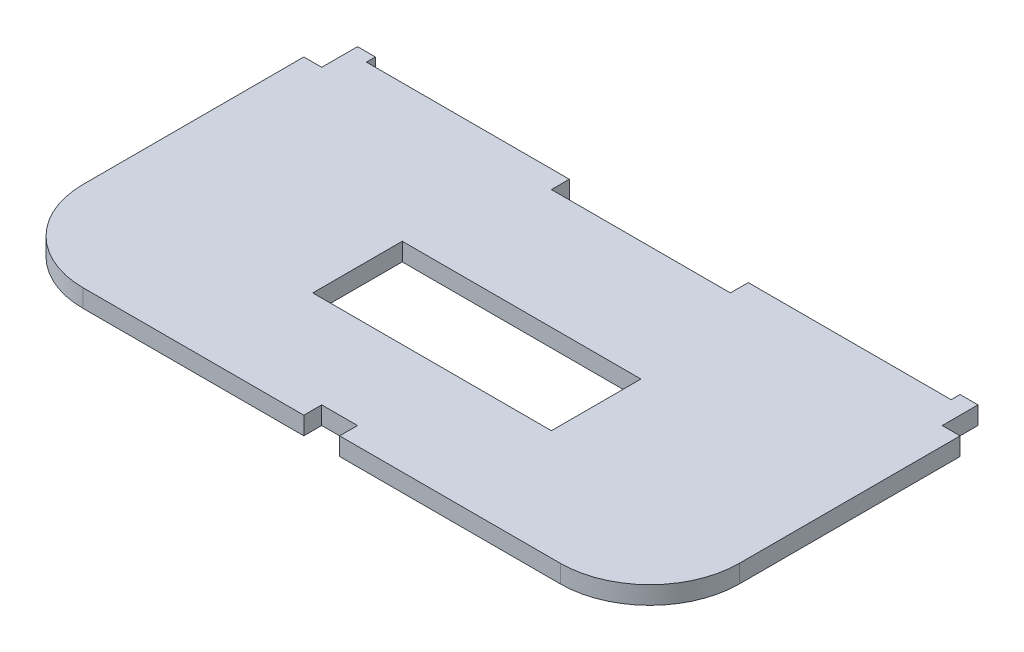
ISO-10303-21;
HEADER;
FILE_DESCRIPTION(('STEP AP214'),'2;1');
FILE_NAME('part.step','',(''),(''),'','','');
FILE_SCHEMA(('AUTOMOTIVE_DESIGN { 1 0 10303 214 1 1 1 1 }'));
ENDSEC;
DATA;
#1=APPLICATION_CONTEXT('core data for automotive mechanical design processes');
#2=APPLICATION_PROTOCOL_DEFINITION('international standard','automotive_design',2000,#1);
#3=PRODUCT_CONTEXT('',#1,'mechanical');
#4=PRODUCT('Part','Part','',(#3));
#5=PRODUCT_RELATED_PRODUCT_CATEGORY('part','',(#4));
#6=PRODUCT_DEFINITION_FORMATION('','',#4);
#7=PRODUCT_DEFINITION_CONTEXT('part definition',#1,'design');
#8=PRODUCT_DEFINITION('design','',#6,#7);
#9=PRODUCT_DEFINITION_SHAPE('','',#8);
#10=(LENGTH_UNIT() NAMED_UNIT(*) SI_UNIT(.MILLI.,.METRE.));
#11=(NAMED_UNIT(*) PLANE_ANGLE_UNIT() SI_UNIT($,.RADIAN.));
#12=(NAMED_UNIT(*) SI_UNIT($,.STERADIAN.) SOLID_ANGLE_UNIT());
#13=UNCERTAINTY_MEASURE_WITH_UNIT(LENGTH_MEASURE(1.E-05),#10,'distance_accuracy_value','');
#14=(GEOMETRIC_REPRESENTATION_CONTEXT(3) GLOBAL_UNCERTAINTY_ASSIGNED_CONTEXT((#13)) GLOBAL_UNIT_ASSIGNED_CONTEXT((#10,
#11,#12)) REPRESENTATION_CONTEXT('',''));
#15=CARTESIAN_POINT('',(0.,0.,0.));
#16=DIRECTION('',(0.,0.,1.));
#17=DIRECTION('',(1.,0.,0.));
#18=AXIS2_PLACEMENT_3D('',#15,#16,#17);
#19=CARTESIAN_POINT('',(70.,3.,0.));
#20=DIRECTION('',(-1.,0.,0.));
#21=DIRECTION('',(0.,0.,1.));
#22=AXIS2_PLACEMENT_3D('',#19,#20,#21);
#23=PLANE('',#22);
#24=DIRECTION('',(0.,0.,-1.));
#25=VECTOR('',#24,1.);
#26=CARTESIAN_POINT('',(70.,0.,0.));
#27=LINE('',#26,#25);
#28=CARTESIAN_POINT('',(70.,0.,-53.5));
#29=VERTEX_POINT('',#28);
#30=CARTESIAN_POINT('',(70.,0.,-56.5));
#31=VERTEX_POINT('',#30);
#32=EDGE_CURVE('E357',#29,#31,#27,.T.);
#33=ORIENTED_EDGE('',*,*,#32,.F.);
#34=DIRECTION('',(0.,-1.,0.));
#35=VECTOR('',#34,1.);
#36=CARTESIAN_POINT('',(70.,3.,-53.5));
#37=LINE('',#36,#35);
#38=CARTESIAN_POINT('',(70.,3.,-53.5));
#39=VERTEX_POINT('',#38);
#40=EDGE_CURVE('E250',#39,#29,#37,.T.);
#41=ORIENTED_EDGE('',*,*,#40,.F.);
#42=DIRECTION('',(0.,0.,-1.));
#43=VECTOR('',#42,1.);
#44=CARTESIAN_POINT('',(70.,3.,0.));
#45=LINE('',#44,#43);
#46=CARTESIAN_POINT('',(70.,3.,-56.5));
#47=VERTEX_POINT('',#46);
#48=EDGE_CURVE('E427',#39,#47,#45,.T.);
#49=ORIENTED_EDGE('',*,*,#48,.T.);
#50=DIRECTION('',(0.,-1.,0.));
#51=VECTOR('',#50,1.);
#52=CARTESIAN_POINT('',(70.,3.,-56.5));
#53=LINE('',#52,#51);
#54=EDGE_CURVE('E238',#47,#31,#53,.T.);
#55=ORIENTED_EDGE('',*,*,#54,.T.);
#56=EDGE_LOOP('',(#33,#41,#49,#55));
#57=FACE_BOUND('',#56,.T.);
#58=ADVANCED_FACE('F41',(#57),#23,.T.);
#59=CARTESIAN_POINT('',(0.,3.,-53.5));
#60=DIRECTION('',(0.,0.,-1.));
#61=DIRECTION('',(-1.,0.,0.));
#62=AXIS2_PLACEMENT_3D('',#59,#60,#61);
#63=PLANE('',#62);
#64=DIRECTION('',(1.,0.,0.));
#65=VECTOR('',#64,1.);
#66=CARTESIAN_POINT('',(0.,0.,-53.5));
#67=LINE('',#66,#65);
#68=CARTESIAN_POINT('',(40.,0.,-53.5));
#69=VERTEX_POINT('',#68);
#70=EDGE_CURVE('E360',#69,#29,#67,.T.);
#71=ORIENTED_EDGE('',*,*,#70,.F.);
#72=DIRECTION('',(0.,-1.,0.));
#73=VECTOR('',#72,1.);
#74=CARTESIAN_POINT('',(40.,3.,-53.5));
#75=LINE('',#74,#73);
#76=CARTESIAN_POINT('',(40.,3.,-53.5));
#77=VERTEX_POINT('',#76);
#78=EDGE_CURVE('E339',#77,#69,#75,.T.);
#79=ORIENTED_EDGE('',*,*,#78,.F.);
#80=DIRECTION('',(1.,0.,0.));
#81=VECTOR('',#80,1.);
#82=CARTESIAN_POINT('',(0.,3.,-53.5));
#83=LINE('',#82,#81);
#84=EDGE_CURVE('E423',#77,#39,#83,.T.);
#85=ORIENTED_EDGE('',*,*,#84,.T.);
#86=ORIENTED_EDGE('',*,*,#40,.T.);
#87=EDGE_LOOP('',(#71,#79,#85,#86));
#88=FACE_BOUND('',#87,.T.);
#89=ADVANCED_FACE('F420',(#88),#63,.T.);
#90=CARTESIAN_POINT('',(40.,3.,0.));
#91=DIRECTION('',(1.,0.,0.));
#92=DIRECTION('',(0.,0.,-1.));
#93=AXIS2_PLACEMENT_3D('',#90,#91,#92);
#94=PLANE('',#93);
#95=DIRECTION('',(0.,0.,1.));
#96=VECTOR('',#95,1.);
#97=CARTESIAN_POINT('',(40.,0.,0.));
#98=LINE('',#97,#96);
#99=CARTESIAN_POINT('',(40.,0.,-56.5));
#100=VERTEX_POINT('',#99);
#101=EDGE_CURVE('E366',#100,#69,#98,.T.);
#102=ORIENTED_EDGE('',*,*,#101,.F.);
#103=DIRECTION('',(0.,-1.,0.));
#104=VECTOR('',#103,1.);
#105=CARTESIAN_POINT('',(40.,3.,-56.5));
#106=LINE('',#105,#104);
#107=CARTESIAN_POINT('',(40.,3.,-56.5));
#108=VERTEX_POINT('',#107);
#109=EDGE_CURVE('E337',#108,#100,#106,.T.);
#110=ORIENTED_EDGE('',*,*,#109,.F.);
#111=DIRECTION('',(0.,0.,1.));
#112=VECTOR('',#111,1.);
#113=CARTESIAN_POINT('',(40.,3.,0.));
#114=LINE('',#113,#112);
#115=EDGE_CURVE('E502',#108,#77,#114,.T.);
#116=ORIENTED_EDGE('',*,*,#115,.T.);
#117=ORIENTED_EDGE('',*,*,#78,.T.);
#118=EDGE_LOOP('',(#102,#110,#116,#117));
#119=FACE_BOUND('',#118,.T.);
#120=ADVANCED_FACE('F415',(#119),#94,.T.);
#121=CARTESIAN_POINT('',(0.,3.,-56.5));
#122=DIRECTION('',(0.,0.,-1.));
#123=DIRECTION('',(-1.,0.,0.));
#124=AXIS2_PLACEMENT_3D('',#121,#122,#123);
#125=PLANE('',#124);
#126=DIRECTION('',(1.,0.,0.));
#127=VECTOR('',#126,1.);
#128=CARTESIAN_POINT('',(0.,0.,-56.5));
#129=LINE('',#128,#127);
#130=CARTESIAN_POINT('',(6.,0.,-56.5));
#131=VERTEX_POINT('',#130);
#132=EDGE_CURVE('E369',#131,#100,#129,.T.);
#133=ORIENTED_EDGE('',*,*,#132,.F.);
#134=DIRECTION('',(0.,-1.,0.));
#135=VECTOR('',#134,1.);
#136=CARTESIAN_POINT('',(6.,3.,-56.5));
#137=LINE('',#136,#135);
#138=CARTESIAN_POINT('',(6.,3.,-56.5));
#139=VERTEX_POINT('',#138);
#140=EDGE_CURVE('E335',#139,#131,#137,.T.);
#141=ORIENTED_EDGE('',*,*,#140,.F.);
#142=DIRECTION('',(1.,0.,0.));
#143=VECTOR('',#142,1.);
#144=CARTESIAN_POINT('',(0.,3.,-56.5));
#145=LINE('',#144,#143);
#146=EDGE_CURVE('E411',#139,#108,#145,.T.);
#147=ORIENTED_EDGE('',*,*,#146,.T.);
#148=ORIENTED_EDGE('',*,*,#109,.T.);
#149=EDGE_LOOP('',(#133,#141,#147,#148));
#150=FACE_BOUND('',#149,.T.);
#151=ADVANCED_FACE('F409',(#150),#125,.T.);
#152=CARTESIAN_POINT('',(6.,3.,0.));
#153=DIRECTION('',(1.,0.,0.));
#154=DIRECTION('',(0.,0.,-1.));
#155=AXIS2_PLACEMENT_3D('',#152,#153,#154);
#156=PLANE('',#155);
#157=DIRECTION('',(0.,0.,1.));
#158=VECTOR('',#157,1.);
#159=CARTESIAN_POINT('',(6.,0.,0.));
#160=LINE('',#159,#158);
#161=CARTESIAN_POINT('',(6.,0.,-58.));
#162=VERTEX_POINT('',#161);
#163=EDGE_CURVE('E372',#162,#131,#160,.T.);
#164=ORIENTED_EDGE('',*,*,#163,.F.);
#165=DIRECTION('',(0.,-1.,0.));
#166=VECTOR('',#165,1.);
#167=CARTESIAN_POINT('',(6.,3.,-58.));
#168=LINE('',#167,#166);
#169=CARTESIAN_POINT('',(6.,3.,-58.));
#170=VERTEX_POINT('',#169);
#171=EDGE_CURVE('E333',#170,#162,#168,.T.);
#172=ORIENTED_EDGE('',*,*,#171,.F.);
#173=DIRECTION('',(0.,0.,1.));
#174=VECTOR('',#173,1.);
#175=CARTESIAN_POINT('',(6.,3.,0.));
#176=LINE('',#175,#174);
#177=EDGE_CURVE('E405',#170,#139,#176,.T.);
#178=ORIENTED_EDGE('',*,*,#177,.T.);
#179=ORIENTED_EDGE('',*,*,#140,.T.);
#180=EDGE_LOOP('',(#164,#172,#178,#179));
#181=FACE_BOUND('',#180,.T.);
#182=ADVANCED_FACE('F402',(#181),#156,.T.);
#183=CARTESIAN_POINT('',(0.,3.,-58.));
#184=DIRECTION('',(0.,0.,-1.));
#185=DIRECTION('',(-1.,0.,0.));
#186=AXIS2_PLACEMENT_3D('',#183,#184,#185);
#187=PLANE('',#186);
#188=DIRECTION('',(1.,0.,0.));
#189=VECTOR('',#188,1.);
#190=CARTESIAN_POINT('',(0.,0.,-58.));
#191=LINE('',#190,#189);
#192=CARTESIAN_POINT('',(3.,0.,-58.));
#193=VERTEX_POINT('',#192);
#194=EDGE_CURVE('E375',#193,#162,#191,.T.);
#195=ORIENTED_EDGE('',*,*,#194,.F.);
#196=DIRECTION('',(0.,-1.,0.));
#197=VECTOR('',#196,1.);
#198=CARTESIAN_POINT('',(3.,3.,-58.));
#199=LINE('',#198,#197);
#200=CARTESIAN_POINT('',(3.,3.,-58.));
#201=VERTEX_POINT('',#200);
#202=EDGE_CURVE('E331',#201,#193,#199,.T.);
#203=ORIENTED_EDGE('',*,*,#202,.F.);
#204=DIRECTION('',(1.,0.,0.));
#205=VECTOR('',#204,1.);
#206=CARTESIAN_POINT('',(0.,3.,-58.));
#207=LINE('',#206,#205);
#208=EDGE_CURVE('E510',#201,#170,#207,.T.);
#209=ORIENTED_EDGE('',*,*,#208,.T.);
#210=ORIENTED_EDGE('',*,*,#171,.T.);
#211=EDGE_LOOP('',(#195,#203,#209,#210));
#212=FACE_BOUND('',#211,.T.);
#213=ADVANCED_FACE('F398',(#212),#187,.T.);
#214=CARTESIAN_POINT('',(3.,3.,0.));
#215=DIRECTION('',(-1.,0.,0.));
#216=DIRECTION('',(0.,0.,1.));
#217=AXIS2_PLACEMENT_3D('',#214,#215,#216);
#218=PLANE('',#217);
#219=DIRECTION('',(0.,0.,-1.));
#220=VECTOR('',#219,1.);
#221=CARTESIAN_POINT('',(3.,0.,0.));
#222=LINE('',#221,#220);
#223=CARTESIAN_POINT('',(3.,0.,-52.));
#224=VERTEX_POINT('',#223);
#225=EDGE_CURVE('E378',#224,#193,#222,.T.);
#226=ORIENTED_EDGE('',*,*,#225,.F.);
#227=DIRECTION('',(0.,-1.,0.));
#228=VECTOR('',#227,1.);
#229=CARTESIAN_POINT('',(3.,3.,-52.));
#230=LINE('',#229,#228);
#231=CARTESIAN_POINT('',(3.,3.,-52.));
#232=VERTEX_POINT('',#231);
#233=EDGE_CURVE('E329',#232,#224,#230,.T.);
#234=ORIENTED_EDGE('',*,*,#233,.F.);
#235=DIRECTION('',(0.,0.,-1.));
#236=VECTOR('',#235,1.);
#237=CARTESIAN_POINT('',(3.,3.,0.));
#238=LINE('',#237,#236);
#239=EDGE_CURVE('E394',#232,#201,#238,.T.);
#240=ORIENTED_EDGE('',*,*,#239,.T.);
#241=ORIENTED_EDGE('',*,*,#202,.T.);
#242=EDGE_LOOP('',(#226,#234,#240,#241));
#243=FACE_BOUND('',#242,.T.);
#244=ADVANCED_FACE('F392',(#243),#218,.T.);
#245=CARTESIAN_POINT('',(0.,3.,-52.));
#246=DIRECTION('',(0.,0.,-1.));
#247=DIRECTION('',(-1.,0.,0.));
#248=AXIS2_PLACEMENT_3D('',#245,#246,#247);
#249=PLANE('',#248);
#250=DIRECTION('',(1.,0.,0.));
#251=VECTOR('',#250,1.);
#252=CARTESIAN_POINT('',(0.,0.,-52.));
#253=LINE('',#252,#251);
#254=CARTESIAN_POINT('',(0.,0.,-52.));
#255=VERTEX_POINT('',#254);
#256=EDGE_CURVE('E279',#255,#224,#253,.T.);
#257=ORIENTED_EDGE('',*,*,#256,.F.);
#258=DIRECTION('',(0.,-1.,0.));
#259=VECTOR('',#258,1.);
#260=CARTESIAN_POINT('',(0.,3.,-52.));
#261=LINE('',#260,#259);
#262=CARTESIAN_POINT('',(0.,3.,-52.));
#263=VERTEX_POINT('',#262);
#264=EDGE_CURVE('E326',#263,#255,#261,.T.);
#265=ORIENTED_EDGE('',*,*,#264,.F.);
#266=DIRECTION('',(1.,0.,0.));
#267=VECTOR('',#266,1.);
#268=CARTESIAN_POINT('',(0.,3.,-52.));
#269=LINE('',#268,#267);
#270=EDGE_CURVE('E388',#263,#232,#269,.T.);
#271=ORIENTED_EDGE('',*,*,#270,.T.);
#272=ORIENTED_EDGE('',*,*,#233,.T.);
#273=EDGE_LOOP('',(#257,#265,#271,#272));
#274=FACE_BOUND('',#273,.T.);
#275=ADVANCED_FACE('F385',(#274),#249,.T.);
#276=CARTESIAN_POINT('',(0.,3.,0.));
#277=DIRECTION('',(-1.,0.,0.));
#278=DIRECTION('',(0.,0.,1.));
#279=AXIS2_PLACEMENT_3D('',#276,#277,#278);
#280=PLANE('',#279);
#281=DIRECTION('',(0.,0.,-1.));
#282=VECTOR('',#281,1.);
#283=CARTESIAN_POINT('',(0.,0.,0.));
#284=LINE('',#283,#282);
#285=CARTESIAN_POINT('',(0.,0.,-15.));
#286=VERTEX_POINT('',#285);
#287=EDGE_CURVE('E275',#286,#255,#284,.T.);
#288=ORIENTED_EDGE('',*,*,#287,.F.);
#289=DIRECTION('',(0.,-1.,0.));
#290=VECTOR('',#289,1.);
#291=CARTESIAN_POINT('',(0.,3.,-15.));
#292=LINE('',#291,#290);
#293=CARTESIAN_POINT('',(0.,3.,-15.));
#294=VERTEX_POINT('',#293);
#295=EDGE_CURVE('E11',#286,#294,#292,.F.);
#296=ORIENTED_EDGE('',*,*,#295,.T.);
#297=DIRECTION('',(0.,0.,-1.));
#298=VECTOR('',#297,1.);
#299=CARTESIAN_POINT('',(0.,3.,0.));
#300=LINE('',#299,#298);
#301=EDGE_CURVE('E488',#294,#263,#300,.T.);
#302=ORIENTED_EDGE('',*,*,#301,.T.);
#303=ORIENTED_EDGE('',*,*,#264,.T.);
#304=EDGE_LOOP('',(#288,#296,#302,#303));
#305=FACE_BOUND('',#304,.T.);
#306=ADVANCED_FACE('F513',(#305),#280,.T.);
#307=CARTESIAN_POINT('',(0.,3.,0.));
#308=DIRECTION('',(0.,0.,-1.));
#309=DIRECTION('',(-1.,0.,0.));
#310=AXIS2_PLACEMENT_3D('',#307,#308,#309);
#311=PLANE('',#310);
#312=DIRECTION('',(1.,0.,0.));
#313=VECTOR('',#312,1.);
#314=CARTESIAN_POINT('',(0.,3.,0.));
#315=LINE('',#314,#313);
#316=CARTESIAN_POINT('',(15.,3.,0.));
#317=VERTEX_POINT('',#316);
#318=CARTESIAN_POINT('',(52.,3.,0.));
#319=VERTEX_POINT('',#318);
#320=EDGE_CURVE('E266',#317,#319,#315,.T.);
#321=ORIENTED_EDGE('',*,*,#320,.F.);
#322=DIRECTION('',(0.,-1.,0.));
#323=VECTOR('',#322,1.);
#324=CARTESIAN_POINT('',(15.,0.,0.));
#325=LINE('',#324,#323);
#326=CARTESIAN_POINT('',(15.,0.,0.));
#327=VERTEX_POINT('',#326);
#328=EDGE_CURVE('E49',#317,#327,#325,.T.);
#329=ORIENTED_EDGE('',*,*,#328,.T.);
#330=DIRECTION('',(1.,0.,0.));
#331=VECTOR('',#330,1.);
#332=CARTESIAN_POINT('',(0.,0.,0.));
#333=LINE('',#332,#331);
#334=CARTESIAN_POINT('',(52.,0.,0.));
#335=VERTEX_POINT('',#334);
#336=EDGE_CURVE('E264',#327,#335,#333,.T.);
#337=ORIENTED_EDGE('',*,*,#336,.T.);
#338=DIRECTION('',(0.,-1.,0.));
#339=VECTOR('',#338,1.);
#340=CARTESIAN_POINT('',(52.,3.,0.));
#341=LINE('',#340,#339);
#342=EDGE_CURVE('E324',#319,#335,#341,.T.);
#343=ORIENTED_EDGE('',*,*,#342,.F.);
#344=EDGE_LOOP('',(#321,#329,#337,#343));
#345=FACE_BOUND('',#344,.T.);
#346=ADVANCED_FACE('F262',(#345),#311,.F.);
#347=CARTESIAN_POINT('',(52.,3.,0.));
#348=DIRECTION('',(1.,0.,0.));
#349=DIRECTION('',(0.,0.,-1.));
#350=AXIS2_PLACEMENT_3D('',#347,#348,#349);
#351=PLANE('',#350);
#352=DIRECTION('',(0.,0.,1.));
#353=VECTOR('',#352,1.);
#354=CARTESIAN_POINT('',(52.,0.,0.));
#355=LINE('',#354,#353);
#356=CARTESIAN_POINT('',(52.,0.,-3.));
#357=VERTEX_POINT('',#356);
#358=EDGE_CURVE('E274',#357,#335,#355,.T.);
#359=ORIENTED_EDGE('',*,*,#358,.F.);
#360=DIRECTION('',(0.,-1.,0.));
#361=VECTOR('',#360,1.);
#362=CARTESIAN_POINT('',(52.,3.,-3.));
#363=LINE('',#362,#361);
#364=CARTESIAN_POINT('',(52.,3.,-3.));
#365=VERTEX_POINT('',#364);
#366=EDGE_CURVE('E322',#365,#357,#363,.T.);
#367=ORIENTED_EDGE('',*,*,#366,.F.);
#368=DIRECTION('',(0.,0.,1.));
#369=VECTOR('',#368,1.);
#370=CARTESIAN_POINT('',(52.,3.,0.));
#371=LINE('',#370,#369);
#372=EDGE_CURVE('E484',#365,#319,#371,.T.);
#373=ORIENTED_EDGE('',*,*,#372,.T.);
#374=ORIENTED_EDGE('',*,*,#342,.T.);
#375=EDGE_LOOP('',(#359,#367,#373,#374));
#376=FACE_BOUND('',#375,.T.);
#377=ADVANCED_FACE('F483',(#376),#351,.T.);
#378=CARTESIAN_POINT('',(0.,3.,-3.));
#379=DIRECTION('',(0.,0.,1.));
#380=DIRECTION('',(1.,0.,0.));
#381=AXIS2_PLACEMENT_3D('',#378,#379,#380);
#382=PLANE('',#381);
#383=DIRECTION('',(-1.,0.,0.));
#384=VECTOR('',#383,1.);
#385=CARTESIAN_POINT('',(0.,0.,-3.));
#386=LINE('',#385,#384);
#387=CARTESIAN_POINT('',(58.,0.,-3.));
#388=VERTEX_POINT('',#387);
#389=EDGE_CURVE('E277',#388,#357,#386,.T.);
#390=ORIENTED_EDGE('',*,*,#389,.F.);
#391=DIRECTION('',(0.,-1.,0.));
#392=VECTOR('',#391,1.);
#393=CARTESIAN_POINT('',(58.,3.,-3.));
#394=LINE('',#393,#392);
#395=CARTESIAN_POINT('',(58.,3.,-3.));
#396=VERTEX_POINT('',#395);
#397=EDGE_CURVE('E320',#396,#388,#394,.T.);
#398=ORIENTED_EDGE('',*,*,#397,.F.);
#399=DIRECTION('',(-1.,0.,0.));
#400=VECTOR('',#399,1.);
#401=CARTESIAN_POINT('',(0.,3.,-3.));
#402=LINE('',#401,#400);
#403=EDGE_CURVE('E479',#396,#365,#402,.T.);
#404=ORIENTED_EDGE('',*,*,#403,.T.);
#405=ORIENTED_EDGE('',*,*,#366,.T.);
#406=EDGE_LOOP('',(#390,#398,#404,#405));
#407=FACE_BOUND('',#406,.T.);
#408=ADVANCED_FACE('F476',(#407),#382,.T.);
#409=CARTESIAN_POINT('',(58.,3.,0.));
#410=DIRECTION('',(1.,0.,0.));
#411=DIRECTION('',(0.,0.,-1.));
#412=AXIS2_PLACEMENT_3D('',#409,#410,#411);
#413=PLANE('',#412);
#414=DIRECTION('',(0.,0.,1.));
#415=VECTOR('',#414,1.);
#416=CARTESIAN_POINT('',(58.,0.,0.));
#417=LINE('',#416,#415);
#418=CARTESIAN_POINT('',(58.,0.,0.));
#419=VERTEX_POINT('',#418);
#420=EDGE_CURVE('E284',#388,#419,#417,.T.);
#421=ORIENTED_EDGE('',*,*,#420,.T.);
#422=DIRECTION('',(0.,-1.,0.));
#423=VECTOR('',#422,1.);
#424=CARTESIAN_POINT('',(58.,3.,0.));
#425=LINE('',#424,#423);
#426=CARTESIAN_POINT('',(58.,3.,0.));
#427=VERTEX_POINT('',#426);
#428=EDGE_CURVE('E317',#427,#419,#425,.T.);
#429=ORIENTED_EDGE('',*,*,#428,.F.);
#430=DIRECTION('',(0.,0.,1.));
#431=VECTOR('',#430,1.);
#432=CARTESIAN_POINT('',(58.,3.,0.));
#433=LINE('',#432,#431);
#434=EDGE_CURVE('E486',#396,#427,#433,.T.);
#435=ORIENTED_EDGE('',*,*,#434,.F.);
#436=ORIENTED_EDGE('',*,*,#397,.T.);
#437=EDGE_LOOP('',(#421,#429,#435,#436));
#438=FACE_BOUND('',#437,.T.);
#439=ADVANCED_FACE('F473',(#438),#413,.F.);
#440=CARTESIAN_POINT('',(0.,3.,0.));
#441=DIRECTION('',(0.,0.,-1.));
#442=DIRECTION('',(-1.,0.,0.));
#443=AXIS2_PLACEMENT_3D('',#440,#441,#442);
#444=PLANE('',#443);
#445=DIRECTION('',(1.,0.,0.));
#446=VECTOR('',#445,1.);
#447=CARTESIAN_POINT('',(0.,0.,0.));
#448=LINE('',#447,#446);
#449=CARTESIAN_POINT('',(95.,0.,0.));
#450=VERTEX_POINT('',#449);
#451=EDGE_CURVE('E287',#419,#450,#448,.T.);
#452=ORIENTED_EDGE('',*,*,#451,.T.);
#453=DIRECTION('',(0.,-1.,0.));
#454=VECTOR('',#453,1.);
#455=CARTESIAN_POINT('',(95.,3.,0.));
#456=LINE('',#455,#454);
#457=CARTESIAN_POINT('',(95.,3.,0.));
#458=VERTEX_POINT('',#457);
#459=EDGE_CURVE('E254',#450,#458,#456,.F.);
#460=ORIENTED_EDGE('',*,*,#459,.T.);
#461=DIRECTION('',(1.,0.,0.));
#462=VECTOR('',#461,1.);
#463=CARTESIAN_POINT('',(0.,3.,0.));
#464=LINE('',#463,#462);
#465=EDGE_CURVE('E469',#427,#458,#464,.T.);
#466=ORIENTED_EDGE('',*,*,#465,.F.);
#467=ORIENTED_EDGE('',*,*,#428,.T.);
#468=EDGE_LOOP('',(#452,#460,#466,#467));
#469=FACE_BOUND('',#468,.T.);
#470=ADVANCED_FACE('F466',(#469),#444,.F.);
#471=CARTESIAN_POINT('',(110.,3.,0.));
#472=DIRECTION('',(-1.,0.,0.));
#473=DIRECTION('',(0.,0.,1.));
#474=AXIS2_PLACEMENT_3D('',#471,#472,#473);
#475=PLANE('',#474);
#476=DIRECTION('',(0.,0.,-1.));
#477=VECTOR('',#476,1.);
#478=CARTESIAN_POINT('',(110.,3.,0.));
#479=LINE('',#478,#477);
#480=CARTESIAN_POINT('',(110.,3.,-15.));
#481=VERTEX_POINT('',#480);
#482=CARTESIAN_POINT('',(110.,3.,-52.));
#483=VERTEX_POINT('',#482);
#484=EDGE_CURVE('E458',#481,#483,#479,.T.);
#485=ORIENTED_EDGE('',*,*,#484,.F.);
#486=DIRECTION('',(0.,-1.,0.));
#487=VECTOR('',#486,1.);
#488=CARTESIAN_POINT('',(110.,3.,-15.));
#489=LINE('',#488,#487);
#490=CARTESIAN_POINT('',(110.,0.,-15.));
#491=VERTEX_POINT('',#490);
#492=EDGE_CURVE('E246',#481,#491,#489,.T.);
#493=ORIENTED_EDGE('',*,*,#492,.T.);
#494=DIRECTION('',(0.,0.,-1.));
#495=VECTOR('',#494,1.);
#496=CARTESIAN_POINT('',(110.,0.,0.));
#497=LINE('',#496,#495);
#498=CARTESIAN_POINT('',(110.,0.,-52.));
#499=VERTEX_POINT('',#498);
#500=EDGE_CURVE('E290',#491,#499,#497,.T.);
#501=ORIENTED_EDGE('',*,*,#500,.T.);
#502=DIRECTION('',(0.,-1.,0.));
#503=VECTOR('',#502,1.);
#504=CARTESIAN_POINT('',(110.,3.,-52.));
#505=LINE('',#504,#503);
#506=EDGE_CURVE('E314',#483,#499,#505,.T.);
#507=ORIENTED_EDGE('',*,*,#506,.F.);
#508=EDGE_LOOP('',(#485,#493,#501,#507));
#509=FACE_BOUND('',#508,.T.);
#510=ADVANCED_FACE('F457',(#509),#475,.F.);
#511=CARTESIAN_POINT('',(0.,3.,-52.));
#512=DIRECTION('',(0.,0.,1.));
#513=DIRECTION('',(1.,0.,0.));
#514=AXIS2_PLACEMENT_3D('',#511,#512,#513);
#515=PLANE('',#514);
#516=DIRECTION('',(-1.,0.,0.));
#517=VECTOR('',#516,1.);
#518=CARTESIAN_POINT('',(0.,0.,-52.));
#519=LINE('',#518,#517);
#520=CARTESIAN_POINT('',(107.,0.,-52.));
#521=VERTEX_POINT('',#520);
#522=EDGE_CURVE('E292',#499,#521,#519,.T.);
#523=ORIENTED_EDGE('',*,*,#522,.T.);
#524=DIRECTION('',(0.,-1.,0.));
#525=VECTOR('',#524,1.);
#526=CARTESIAN_POINT('',(107.,3.,-52.));
#527=LINE('',#526,#525);
#528=CARTESIAN_POINT('',(107.,3.,-52.));
#529=VERTEX_POINT('',#528);
#530=EDGE_CURVE('E311',#529,#521,#527,.T.);
#531=ORIENTED_EDGE('',*,*,#530,.F.);
#532=DIRECTION('',(-1.,0.,0.));
#533=VECTOR('',#532,1.);
#534=CARTESIAN_POINT('',(0.,3.,-52.));
#535=LINE('',#534,#533);
#536=EDGE_CURVE('E454',#483,#529,#535,.T.);
#537=ORIENTED_EDGE('',*,*,#536,.F.);
#538=ORIENTED_EDGE('',*,*,#506,.T.);
#539=EDGE_LOOP('',(#523,#531,#537,#538));
#540=FACE_BOUND('',#539,.T.);
#541=ADVANCED_FACE('F452',(#540),#515,.F.);
#542=CARTESIAN_POINT('',(107.,3.,0.));
#543=DIRECTION('',(-1.,0.,0.));
#544=DIRECTION('',(0.,0.,1.));
#545=AXIS2_PLACEMENT_3D('',#542,#543,#544);
#546=PLANE('',#545);
#547=DIRECTION('',(0.,0.,-1.));
#548=VECTOR('',#547,1.);
#549=CARTESIAN_POINT('',(107.,0.,0.));
#550=LINE('',#549,#548);
#551=CARTESIAN_POINT('',(107.,0.,-58.));
#552=VERTEX_POINT('',#551);
#553=EDGE_CURVE('E295',#521,#552,#550,.T.);
#554=ORIENTED_EDGE('',*,*,#553,.T.);
#555=DIRECTION('',(0.,-1.,0.));
#556=VECTOR('',#555,1.);
#557=CARTESIAN_POINT('',(107.,3.,-58.));
#558=LINE('',#557,#556);
#559=CARTESIAN_POINT('',(107.,3.,-58.));
#560=VERTEX_POINT('',#559);
#561=EDGE_CURVE('E309',#560,#552,#558,.T.);
#562=ORIENTED_EDGE('',*,*,#561,.F.);
#563=DIRECTION('',(0.,0.,-1.));
#564=VECTOR('',#563,1.);
#565=CARTESIAN_POINT('',(107.,3.,0.));
#566=LINE('',#565,#564);
#567=EDGE_CURVE('E496',#529,#560,#566,.T.);
#568=ORIENTED_EDGE('',*,*,#567,.F.);
#569=ORIENTED_EDGE('',*,*,#530,.T.);
#570=EDGE_LOOP('',(#554,#562,#568,#569));
#571=FACE_BOUND('',#570,.T.);
#572=ADVANCED_FACE('F446',(#571),#546,.F.);
#573=CARTESIAN_POINT('',(0.,3.,-58.));
#574=DIRECTION('',(0.,0.,-1.));
#575=DIRECTION('',(-1.,0.,0.));
#576=AXIS2_PLACEMENT_3D('',#573,#574,#575);
#577=PLANE('',#576);
#578=DIRECTION('',(1.,0.,0.));
#579=VECTOR('',#578,1.);
#580=CARTESIAN_POINT('',(0.,0.,-58.));
#581=LINE('',#580,#579);
#582=CARTESIAN_POINT('',(104.,0.,-58.));
#583=VERTEX_POINT('',#582);
#584=EDGE_CURVE('E298',#583,#552,#581,.T.);
#585=ORIENTED_EDGE('',*,*,#584,.F.);
#586=DIRECTION('',(0.,-1.,0.));
#587=VECTOR('',#586,1.);
#588=CARTESIAN_POINT('',(104.,3.,-58.));
#589=LINE('',#588,#587);
#590=CARTESIAN_POINT('',(104.,3.,-58.));
#591=VERTEX_POINT('',#590);
#592=EDGE_CURVE('E307',#591,#583,#589,.T.);
#593=ORIENTED_EDGE('',*,*,#592,.F.);
#594=DIRECTION('',(1.,0.,0.));
#595=VECTOR('',#594,1.);
#596=CARTESIAN_POINT('',(0.,3.,-58.));
#597=LINE('',#596,#595);
#598=EDGE_CURVE('E444',#591,#560,#597,.T.);
#599=ORIENTED_EDGE('',*,*,#598,.T.);
#600=ORIENTED_EDGE('',*,*,#561,.T.);
#601=EDGE_LOOP('',(#585,#593,#599,#600));
#602=FACE_BOUND('',#601,.T.);
#603=ADVANCED_FACE('F442',(#602),#577,.T.);
#604=CARTESIAN_POINT('',(104.,3.,0.));
#605=DIRECTION('',(-1.,0.,0.));
#606=DIRECTION('',(0.,0.,1.));
#607=AXIS2_PLACEMENT_3D('',#604,#605,#606);
#608=PLANE('',#607);
#609=DIRECTION('',(0.,0.,-1.));
#610=VECTOR('',#609,1.);
#611=CARTESIAN_POINT('',(104.,0.,0.));
#612=LINE('',#611,#610);
#613=CARTESIAN_POINT('',(104.,0.,-56.5));
#614=VERTEX_POINT('',#613);
#615=EDGE_CURVE('E301',#614,#583,#612,.T.);
#616=ORIENTED_EDGE('',*,*,#615,.F.);
#617=DIRECTION('',(0.,-1.,0.));
#618=VECTOR('',#617,1.);
#619=CARTESIAN_POINT('',(104.,3.,-56.5));
#620=LINE('',#619,#618);
#621=CARTESIAN_POINT('',(104.,3.,-56.5));
#622=VERTEX_POINT('',#621);
#623=EDGE_CURVE('E240',#622,#614,#620,.T.);
#624=ORIENTED_EDGE('',*,*,#623,.F.);
#625=DIRECTION('',(0.,0.,-1.));
#626=VECTOR('',#625,1.);
#627=CARTESIAN_POINT('',(104.,3.,0.));
#628=LINE('',#627,#626);
#629=EDGE_CURVE('E438',#622,#591,#628,.T.);
#630=ORIENTED_EDGE('',*,*,#629,.T.);
#631=ORIENTED_EDGE('',*,*,#592,.T.);
#632=EDGE_LOOP('',(#616,#624,#630,#631));
#633=FACE_BOUND('',#632,.T.);
#634=ADVANCED_FACE('F435',(#633),#608,.T.);
#635=CARTESIAN_POINT('',(0.,3.,-33.5));
#636=DIRECTION('',(0.,0.,-1.));
#637=DIRECTION('',(-1.,0.,0.));
#638=AXIS2_PLACEMENT_3D('',#635,#636,#637);
#639=PLANE('',#638);
#640=DIRECTION('',(1.,0.,0.));
#641=VECTOR('',#640,1.);
#642=CARTESIAN_POINT('',(0.,0.,-33.5));
#643=LINE('',#642,#641);
#644=CARTESIAN_POINT('',(35.,0.,-33.5));
#645=VERTEX_POINT('',#644);
#646=CARTESIAN_POINT('',(75.,0.,-33.5));
#647=VERTEX_POINT('',#646);
#648=EDGE_CURVE('E237',#645,#647,#643,.T.);
#649=ORIENTED_EDGE('',*,*,#648,.T.);
#650=DIRECTION('',(0.,-1.,0.));
#651=VECTOR('',#650,1.);
#652=CARTESIAN_POINT('',(75.,3.,-33.5));
#653=LINE('',#652,#651);
#654=CARTESIAN_POINT('',(75.,3.,-33.5));
#655=VERTEX_POINT('',#654);
#656=EDGE_CURVE('E218',#655,#647,#653,.T.);
#657=ORIENTED_EDGE('',*,*,#656,.F.);
#658=DIRECTION('',(1.,0.,0.));
#659=VECTOR('',#658,1.);
#660=CARTESIAN_POINT('',(0.,3.,-33.5));
#661=LINE('',#660,#659);
#662=CARTESIAN_POINT('',(35.,3.,-33.5));
#663=VERTEX_POINT('',#662);
#664=EDGE_CURVE('E225',#663,#655,#661,.T.);
#665=ORIENTED_EDGE('',*,*,#664,.F.);
#666=DIRECTION('',(0.,-1.,0.));
#667=VECTOR('',#666,1.);
#668=CARTESIAN_POINT('',(35.,3.,-33.5));
#669=LINE('',#668,#667);
#670=EDGE_CURVE('E342',#663,#645,#669,.T.);
#671=ORIENTED_EDGE('',*,*,#670,.T.);
#672=EDGE_LOOP('',(#649,#657,#665,#671));
#673=FACE_BOUND('',#672,.T.);
#674=ADVANCED_FACE('F235',(#673),#639,.F.);
#675=CARTESIAN_POINT('',(75.,3.,0.));
#676=DIRECTION('',(1.,0.,0.));
#677=DIRECTION('',(0.,0.,-1.));
#678=AXIS2_PLACEMENT_3D('',#675,#676,#677);
#679=PLANE('',#678);
#680=DIRECTION('',(0.,0.,1.));
#681=VECTOR('',#680,1.);
#682=CARTESIAN_POINT('',(75.,0.,0.));
#683=LINE('',#682,#681);
#684=CARTESIAN_POINT('',(75.,0.,-18.5));
#685=VERTEX_POINT('',#684);
#686=EDGE_CURVE('E355',#647,#685,#683,.T.);
#687=ORIENTED_EDGE('',*,*,#686,.T.);
#688=DIRECTION('',(0.,-1.,0.));
#689=VECTOR('',#688,1.);
#690=CARTESIAN_POINT('',(75.,3.,-18.5));
#691=LINE('',#690,#689);
#692=CARTESIAN_POINT('',(75.,3.,-18.5));
#693=VERTEX_POINT('',#692);
#694=EDGE_CURVE('E220',#693,#685,#691,.T.);
#695=ORIENTED_EDGE('',*,*,#694,.F.);
#696=DIRECTION('',(0.,0.,1.));
#697=VECTOR('',#696,1.);
#698=CARTESIAN_POINT('',(75.,3.,0.));
#699=LINE('',#698,#697);
#700=EDGE_CURVE('E213',#655,#693,#699,.T.);
#701=ORIENTED_EDGE('',*,*,#700,.F.);
#702=ORIENTED_EDGE('',*,*,#656,.T.);
#703=EDGE_LOOP('',(#687,#695,#701,#702));
#704=FACE_BOUND('',#703,.T.);
#705=ADVANCED_FACE('F216',(#704),#679,.F.);
#706=CARTESIAN_POINT('',(0.,3.,-18.5));
#707=DIRECTION('',(0.,0.,-1.));
#708=DIRECTION('',(-1.,0.,0.));
#709=AXIS2_PLACEMENT_3D('',#706,#707,#708);
#710=PLANE('',#709);
#711=DIRECTION('',(1.,0.,0.));
#712=VECTOR('',#711,1.);
#713=CARTESIAN_POINT('',(0.,0.,-18.5));
#714=LINE('',#713,#712);
#715=CARTESIAN_POINT('',(35.,0.,-18.5));
#716=VERTEX_POINT('',#715);
#717=EDGE_CURVE('E352',#716,#685,#714,.T.);
#718=ORIENTED_EDGE('',*,*,#717,.F.);
#719=DIRECTION('',(0.,-1.,0.));
#720=VECTOR('',#719,1.);
#721=CARTESIAN_POINT('',(35.,3.,-18.5));
#722=LINE('',#721,#720);
#723=CARTESIAN_POINT('',(35.,3.,-18.5));
#724=VERTEX_POINT('',#723);
#725=EDGE_CURVE('E242',#724,#716,#722,.T.);
#726=ORIENTED_EDGE('',*,*,#725,.F.);
#727=DIRECTION('',(1.,0.,0.));
#728=VECTOR('',#727,1.);
#729=CARTESIAN_POINT('',(0.,3.,-18.5));
#730=LINE('',#729,#728);
#731=EDGE_CURVE('E224',#724,#693,#730,.T.);
#732=ORIENTED_EDGE('',*,*,#731,.T.);
#733=ORIENTED_EDGE('',*,*,#694,.T.);
#734=EDGE_LOOP('',(#718,#726,#732,#733));
#735=FACE_BOUND('',#734,.T.);
#736=ADVANCED_FACE('F353',(#735),#710,.T.);
#737=CARTESIAN_POINT('',(35.,3.,0.));
#738=DIRECTION('',(1.,0.,0.));
#739=DIRECTION('',(0.,0.,-1.));
#740=AXIS2_PLACEMENT_3D('',#737,#738,#739);
#741=PLANE('',#740);
#742=DIRECTION('',(0.,0.,1.));
#743=VECTOR('',#742,1.);
#744=CARTESIAN_POINT('',(35.,0.,0.));
#745=LINE('',#744,#743);
#746=EDGE_CURVE('E349',#645,#716,#745,.T.);
#747=ORIENTED_EDGE('',*,*,#746,.F.);
#748=ORIENTED_EDGE('',*,*,#670,.F.);
#749=DIRECTION('',(0.,0.,1.));
#750=VECTOR('',#749,1.);
#751=CARTESIAN_POINT('',(35.,3.,0.));
#752=LINE('',#751,#750);
#753=EDGE_CURVE('E231',#663,#724,#752,.T.);
#754=ORIENTED_EDGE('',*,*,#753,.T.);
#755=ORIENTED_EDGE('',*,*,#725,.T.);
#756=EDGE_LOOP('',(#747,#748,#754,#755));
#757=FACE_BOUND('',#756,.T.);
#758=ADVANCED_FACE('F347',(#757),#741,.T.);
#759=CARTESIAN_POINT('',(0.,3.,-56.5));
#760=DIRECTION('',(0.,0.,-1.));
#761=DIRECTION('',(-1.,0.,0.));
#762=AXIS2_PLACEMENT_3D('',#759,#760,#761);
#763=PLANE('',#762);
#764=DIRECTION('',(1.,0.,0.));
#765=VECTOR('',#764,1.);
#766=CARTESIAN_POINT('',(0.,0.,-56.5));
#767=LINE('',#766,#765);
#768=EDGE_CURVE('E233',#31,#614,#767,.T.);
#769=ORIENTED_EDGE('',*,*,#768,.F.);
#770=ORIENTED_EDGE('',*,*,#54,.F.);
#771=DIRECTION('',(1.,0.,0.));
#772=VECTOR('',#771,1.);
#773=CARTESIAN_POINT('',(0.,3.,-56.5));
#774=LINE('',#773,#772);
#775=EDGE_CURVE('E343',#47,#622,#774,.T.);
#776=ORIENTED_EDGE('',*,*,#775,.T.);
#777=ORIENTED_EDGE('',*,*,#623,.T.);
#778=EDGE_LOOP('',(#769,#770,#776,#777));
#779=FACE_BOUND('',#778,.T.);
#780=ADVANCED_FACE('F431',(#779),#763,.T.);
#781=CARTESIAN_POINT('',(0.,3.,0.));
#782=DIRECTION('',(0.,1.,0.));
#783=DIRECTION('',(0.,0.,1.));
#784=AXIS2_PLACEMENT_3D('',#781,#782,#783);
#785=PLANE('',#784);
#786=ORIENTED_EDGE('',*,*,#664,.T.);
#787=ORIENTED_EDGE('',*,*,#700,.T.);
#788=ORIENTED_EDGE('',*,*,#731,.F.);
#789=ORIENTED_EDGE('',*,*,#753,.F.);
#790=EDGE_LOOP('',(#786,#787,#788,#789));
#791=FACE_BOUND('',#790,.T.);
#792=ORIENTED_EDGE('',*,*,#465,.T.);
#793=CARTESIAN_POINT('',(95.,3.,-15.));
#794=DIRECTION('',(0.,1.,0.));
#795=DIRECTION('',(0.,0.,1.));
#796=AXIS2_PLACEMENT_3D('',#793,#794,#795);
#797=CIRCLE('',#796,15.);
#798=EDGE_CURVE('E257',#458,#481,#797,.T.);
#799=ORIENTED_EDGE('',*,*,#798,.T.);
#800=ORIENTED_EDGE('',*,*,#484,.T.);
#801=ORIENTED_EDGE('',*,*,#536,.T.);
#802=ORIENTED_EDGE('',*,*,#567,.T.);
#803=ORIENTED_EDGE('',*,*,#598,.F.);
#804=ORIENTED_EDGE('',*,*,#629,.F.);
#805=ORIENTED_EDGE('',*,*,#775,.F.);
#806=ORIENTED_EDGE('',*,*,#48,.F.);
#807=ORIENTED_EDGE('',*,*,#84,.F.);
#808=ORIENTED_EDGE('',*,*,#115,.F.);
#809=ORIENTED_EDGE('',*,*,#146,.F.);
#810=ORIENTED_EDGE('',*,*,#177,.F.);
#811=ORIENTED_EDGE('',*,*,#208,.F.);
#812=ORIENTED_EDGE('',*,*,#239,.F.);
#813=ORIENTED_EDGE('',*,*,#270,.F.);
#814=ORIENTED_EDGE('',*,*,#301,.F.);
#815=CARTESIAN_POINT('',(15.,3.,-15.));
#816=DIRECTION('',(0.,1.,0.));
#817=DIRECTION('',(0.,0.,1.));
#818=AXIS2_PLACEMENT_3D('',#815,#816,#817);
#819=CIRCLE('',#818,15.);
#820=EDGE_CURVE('E56',#294,#317,#819,.T.);
#821=ORIENTED_EDGE('',*,*,#820,.T.);
#822=ORIENTED_EDGE('',*,*,#320,.T.);
#823=ORIENTED_EDGE('',*,*,#372,.F.);
#824=ORIENTED_EDGE('',*,*,#403,.F.);
#825=ORIENTED_EDGE('',*,*,#434,.T.);
#826=EDGE_LOOP('',(#792,#799,#800,#801,#802,#803,#804,#805,#806,#807,#808,#809,#810,#811,#812,
#813,#814,#821,#822,#823,#824,#825));
#827=FACE_BOUND('',#826,.T.);
#828=ADVANCED_FACE('F229',(#791,#827),#785,.T.);
#829=CARTESIAN_POINT('',(0.,0.,0.));
#830=DIRECTION('',(0.,1.,0.));
#831=DIRECTION('',(0.,0.,1.));
#832=AXIS2_PLACEMENT_3D('',#829,#830,#831);
#833=PLANE('',#832);
#834=ORIENTED_EDGE('',*,*,#648,.F.);
#835=ORIENTED_EDGE('',*,*,#746,.T.);
#836=ORIENTED_EDGE('',*,*,#717,.T.);
#837=ORIENTED_EDGE('',*,*,#686,.F.);
#838=EDGE_LOOP('',(#834,#835,#836,#837));
#839=FACE_BOUND('',#838,.T.);
#840=ORIENTED_EDGE('',*,*,#500,.F.);
#841=CARTESIAN_POINT('',(95.,0.,-15.));
#842=DIRECTION('',(0.,1.,0.));
#843=DIRECTION('',(0.,0.,1.));
#844=AXIS2_PLACEMENT_3D('',#841,#842,#843);
#845=CIRCLE('',#844,15.);
#846=EDGE_CURVE('E252',#491,#450,#845,.F.);
#847=ORIENTED_EDGE('',*,*,#846,.T.);
#848=ORIENTED_EDGE('',*,*,#451,.F.);
#849=ORIENTED_EDGE('',*,*,#420,.F.);
#850=ORIENTED_EDGE('',*,*,#389,.T.);
#851=ORIENTED_EDGE('',*,*,#358,.T.);
#852=ORIENTED_EDGE('',*,*,#336,.F.);
#853=CARTESIAN_POINT('',(15.,0.,-15.));
#854=DIRECTION('',(0.,1.,0.));
#855=DIRECTION('',(0.,0.,1.));
#856=AXIS2_PLACEMENT_3D('',#853,#854,#855);
#857=CIRCLE('',#856,15.);
#858=EDGE_CURVE('E249',#327,#286,#857,.F.);
#859=ORIENTED_EDGE('',*,*,#858,.T.);
#860=ORIENTED_EDGE('',*,*,#287,.T.);
#861=ORIENTED_EDGE('',*,*,#256,.T.);
#862=ORIENTED_EDGE('',*,*,#225,.T.);
#863=ORIENTED_EDGE('',*,*,#194,.T.);
#864=ORIENTED_EDGE('',*,*,#163,.T.);
#865=ORIENTED_EDGE('',*,*,#132,.T.);
#866=ORIENTED_EDGE('',*,*,#101,.T.);
#867=ORIENTED_EDGE('',*,*,#70,.T.);
#868=ORIENTED_EDGE('',*,*,#32,.T.);
#869=ORIENTED_EDGE('',*,*,#768,.T.);
#870=ORIENTED_EDGE('',*,*,#615,.T.);
#871=ORIENTED_EDGE('',*,*,#584,.T.);
#872=ORIENTED_EDGE('',*,*,#553,.F.);
#873=ORIENTED_EDGE('',*,*,#522,.F.);
#874=EDGE_LOOP('',(#840,#847,#848,#849,#850,#851,#852,#859,#860,#861,#862,#863,#864,#865,#866,
#867,#868,#869,#870,#871,#872,#873));
#875=FACE_BOUND('',#874,.T.);
#876=ADVANCED_FACE('F271',(#839,#875),#833,.F.);
#877=CARTESIAN_POINT('',(95.,3.,-15.));
#878=DIRECTION('',(0.,-1.,0.));
#879=DIRECTION('',(0.,0.,-1.));
#880=AXIS2_PLACEMENT_3D('',#877,#878,#879);
#881=CYLINDRICAL_SURFACE('',#880,15.);
#882=ORIENTED_EDGE('',*,*,#798,.F.);
#883=ORIENTED_EDGE('',*,*,#459,.F.);
#884=ORIENTED_EDGE('',*,*,#846,.F.);
#885=ORIENTED_EDGE('',*,*,#492,.F.);
#886=EDGE_LOOP('',(#882,#883,#884,#885));
#887=FACE_BOUND('',#886,.T.);
#888=ADVANCED_FACE('F462',(#887),#881,.T.);
#889=CARTESIAN_POINT('',(15.,3.,-15.));
#890=DIRECTION('',(0.,1.,0.));
#891=DIRECTION('',(0.,0.,1.));
#892=AXIS2_PLACEMENT_3D('',#889,#890,#891);
#893=CYLINDRICAL_SURFACE('',#892,15.);
#894=ORIENTED_EDGE('',*,*,#820,.F.);
#895=ORIENTED_EDGE('',*,*,#295,.F.);
#896=ORIENTED_EDGE('',*,*,#858,.F.);
#897=ORIENTED_EDGE('',*,*,#328,.F.);
#898=EDGE_LOOP('',(#894,#895,#896,#897));
#899=FACE_BOUND('',#898,.T.);
#900=ADVANCED_FACE('F43',(#899),#893,.T.);
#901=CLOSED_SHELL('',(#58,#89,#120,#151,#182,#213,#244,#275,#306,#346,#377,#408,#439,#470,#510,
#541,#572,#603,#634,#674,#705,#736,#758,#780,#828,#876,#888,#900));
#902=MANIFOLD_SOLID_BREP('B2',#901);
#903=ADVANCED_BREP_SHAPE_REPRESENTATION('',(#18,#902),#14);
#904=SHAPE_DEFINITION_REPRESENTATION(#9,#903);
ENDSEC;
END-ISO-10303-21;
